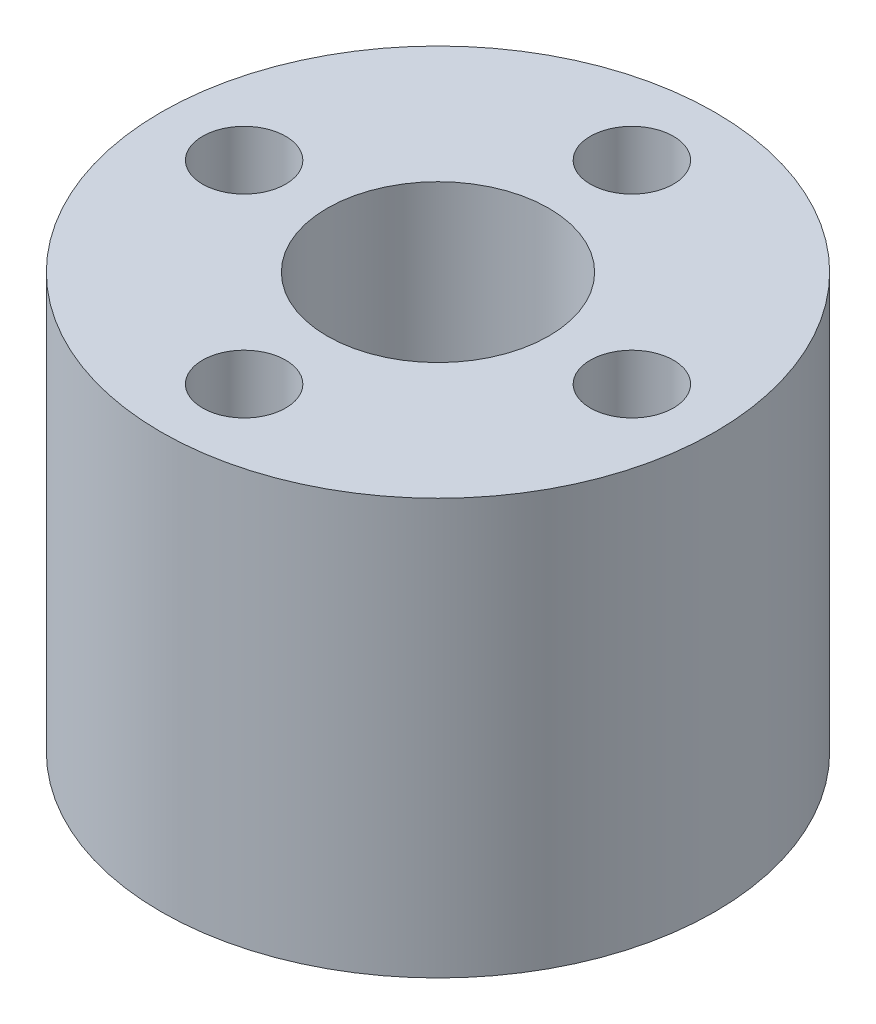
ISO-10303-21;
HEADER;
FILE_DESCRIPTION(('STEP AP214'),'2;1');
FILE_NAME('part.step','',(''),(''),'','','');
FILE_SCHEMA(('AUTOMOTIVE_DESIGN { 1 0 10303 214 1 1 1 1 }'));
ENDSEC;
DATA;
#1=APPLICATION_CONTEXT('core data for automotive mechanical design processes');
#2=APPLICATION_PROTOCOL_DEFINITION('international standard','automotive_design',2000,#1);
#3=PRODUCT_CONTEXT('',#1,'mechanical');
#4=PRODUCT('Part','Part','',(#3));
#5=PRODUCT_RELATED_PRODUCT_CATEGORY('part','',(#4));
#6=PRODUCT_DEFINITION_FORMATION('','',#4);
#7=PRODUCT_DEFINITION_CONTEXT('part definition',#1,'design');
#8=PRODUCT_DEFINITION('design','',#6,#7);
#9=PRODUCT_DEFINITION_SHAPE('','',#8);
#10=(LENGTH_UNIT() NAMED_UNIT(*) SI_UNIT(.MILLI.,.METRE.));
#11=(NAMED_UNIT(*) PLANE_ANGLE_UNIT() SI_UNIT($,.RADIAN.));
#12=(NAMED_UNIT(*) SI_UNIT($,.STERADIAN.) SOLID_ANGLE_UNIT());
#13=UNCERTAINTY_MEASURE_WITH_UNIT(LENGTH_MEASURE(1.E-05),#10,'distance_accuracy_value','');
#14=(GEOMETRIC_REPRESENTATION_CONTEXT(3) GLOBAL_UNCERTAINTY_ASSIGNED_CONTEXT((#13)) GLOBAL_UNIT_ASSIGNED_CONTEXT((#10,
#11,#12)) REPRESENTATION_CONTEXT('',''));
#15=CARTESIAN_POINT('',(0.,0.,0.));
#16=DIRECTION('',(0.,0.,1.));
#17=DIRECTION('',(1.,0.,0.));
#18=AXIS2_PLACEMENT_3D('',#15,#16,#17);
#19=CARTESIAN_POINT('',(0.,15.,0.));
#20=DIRECTION('',(0.,-1.,0.));
#21=DIRECTION('',(0.,0.,-1.));
#22=AXIS2_PLACEMENT_3D('',#19,#20,#21);
#23=CYLINDRICAL_SURFACE('',#22,4.);
#24=CARTESIAN_POINT('',(0.,15.,0.));
#25=DIRECTION('',(0.,1.,0.));
#26=DIRECTION('',(0.,0.,1.));
#27=AXIS2_PLACEMENT_3D('',#24,#25,#26);
#28=CIRCLE('',#27,4.);
#29=CARTESIAN_POINT('',(0.,15.,4.));
#30=VERTEX_POINT('',#29);
#31=EDGE_CURVE('E43',#30,#30,#28,.T.);
#32=ORIENTED_EDGE('',*,*,#31,.T.);
#33=EDGE_LOOP('',(#32));
#34=FACE_BOUND('',#33,.T.);
#35=CARTESIAN_POINT('',(0.,0.,0.));
#36=DIRECTION('',(0.,1.,0.));
#37=DIRECTION('',(0.,0.,1.));
#38=AXIS2_PLACEMENT_3D('',#35,#36,#37);
#39=CIRCLE('',#38,4.);
#40=CARTESIAN_POINT('',(0.,0.,4.));
#41=VERTEX_POINT('',#40);
#42=EDGE_CURVE('E63',#41,#41,#39,.T.);
#43=ORIENTED_EDGE('',*,*,#42,.F.);
#44=EDGE_LOOP('',(#43));
#45=FACE_BOUND('',#44,.T.);
#46=ADVANCED_FACE('F35',(#34,#45),#23,.F.);
#47=CARTESIAN_POINT('',(7.,15.,0.));
#48=DIRECTION('',(0.,-1.,0.));
#49=DIRECTION('',(0.,0.,-1.));
#50=AXIS2_PLACEMENT_3D('',#47,#48,#49);
#51=CYLINDRICAL_SURFACE('',#50,1.5);
#52=CARTESIAN_POINT('',(7.,15.,0.));
#53=DIRECTION('',(0.,1.,0.));
#54=DIRECTION('',(0.,0.,1.));
#55=AXIS2_PLACEMENT_3D('',#52,#53,#54);
#56=CIRCLE('',#55,1.5);
#57=CARTESIAN_POINT('',(7.,15.,1.5));
#58=VERTEX_POINT('',#57);
#59=EDGE_CURVE('E48',#58,#58,#56,.T.);
#60=ORIENTED_EDGE('',*,*,#59,.T.);
#61=EDGE_LOOP('',(#60));
#62=FACE_BOUND('',#61,.T.);
#63=CARTESIAN_POINT('',(7.,0.,0.));
#64=DIRECTION('',(0.,1.,0.));
#65=DIRECTION('',(0.,0.,1.));
#66=AXIS2_PLACEMENT_3D('',#63,#64,#65);
#67=CIRCLE('',#66,1.5);
#68=CARTESIAN_POINT('',(7.,0.,1.5));
#69=VERTEX_POINT('',#68);
#70=EDGE_CURVE('E61',#69,#69,#67,.T.);
#71=ORIENTED_EDGE('',*,*,#70,.F.);
#72=EDGE_LOOP('',(#71));
#73=FACE_BOUND('',#72,.T.);
#74=ADVANCED_FACE('F84',(#62,#73),#51,.F.);
#75=CARTESIAN_POINT('',(0.,15.,-7.));
#76=DIRECTION('',(0.,-1.,0.));
#77=DIRECTION('',(0.,0.,-1.));
#78=AXIS2_PLACEMENT_3D('',#75,#76,#77);
#79=CYLINDRICAL_SURFACE('',#78,1.5);
#80=CARTESIAN_POINT('',(0.,15.,-7.));
#81=DIRECTION('',(0.,1.,0.));
#82=DIRECTION('',(0.,0.,1.));
#83=AXIS2_PLACEMENT_3D('',#80,#81,#82);
#84=CIRCLE('',#83,1.5);
#85=CARTESIAN_POINT('',(0.,15.,-5.5));
#86=VERTEX_POINT('',#85);
#87=EDGE_CURVE('E77',#86,#86,#84,.T.);
#88=ORIENTED_EDGE('',*,*,#87,.T.);
#89=EDGE_LOOP('',(#88));
#90=FACE_BOUND('',#89,.T.);
#91=CARTESIAN_POINT('',(0.,0.,-7.));
#92=DIRECTION('',(0.,1.,0.));
#93=DIRECTION('',(0.,0.,1.));
#94=AXIS2_PLACEMENT_3D('',#91,#92,#93);
#95=CIRCLE('',#94,1.5);
#96=CARTESIAN_POINT('',(0.,0.,-5.5));
#97=VERTEX_POINT('',#96);
#98=EDGE_CURVE('E58',#97,#97,#95,.T.);
#99=ORIENTED_EDGE('',*,*,#98,.F.);
#100=EDGE_LOOP('',(#99));
#101=FACE_BOUND('',#100,.T.);
#102=ADVANCED_FACE('F102',(#90,#101),#79,.F.);
#103=CARTESIAN_POINT('',(-7.,15.,0.));
#104=DIRECTION('',(0.,-1.,0.));
#105=DIRECTION('',(0.,0.,-1.));
#106=AXIS2_PLACEMENT_3D('',#103,#104,#105);
#107=CYLINDRICAL_SURFACE('',#106,1.5);
#108=CARTESIAN_POINT('',(-7.,15.,0.));
#109=DIRECTION('',(0.,1.,0.));
#110=DIRECTION('',(0.,0.,1.));
#111=AXIS2_PLACEMENT_3D('',#108,#109,#110);
#112=CIRCLE('',#111,1.5);
#113=CARTESIAN_POINT('',(-7.,15.,1.5));
#114=VERTEX_POINT('',#113);
#115=EDGE_CURVE('E72',#114,#114,#112,.T.);
#116=ORIENTED_EDGE('',*,*,#115,.T.);
#117=EDGE_LOOP('',(#116));
#118=FACE_BOUND('',#117,.T.);
#119=CARTESIAN_POINT('',(-7.,0.,0.));
#120=DIRECTION('',(0.,1.,0.));
#121=DIRECTION('',(0.,0.,1.));
#122=AXIS2_PLACEMENT_3D('',#119,#120,#121);
#123=CIRCLE('',#122,1.5);
#124=CARTESIAN_POINT('',(-7.,0.,1.5));
#125=VERTEX_POINT('',#124);
#126=EDGE_CURVE('E55',#125,#125,#123,.T.);
#127=ORIENTED_EDGE('',*,*,#126,.F.);
#128=EDGE_LOOP('',(#127));
#129=FACE_BOUND('',#128,.T.);
#130=ADVANCED_FACE('F108',(#118,#129),#107,.F.);
#131=CARTESIAN_POINT('',(0.,15.,7.));
#132=DIRECTION('',(0.,-1.,0.));
#133=DIRECTION('',(0.,0.,-1.));
#134=AXIS2_PLACEMENT_3D('',#131,#132,#133);
#135=CYLINDRICAL_SURFACE('',#134,1.5);
#136=CARTESIAN_POINT('',(0.,15.,7.));
#137=DIRECTION('',(0.,1.,0.));
#138=DIRECTION('',(0.,0.,1.));
#139=AXIS2_PLACEMENT_3D('',#136,#137,#138);
#140=CIRCLE('',#139,1.5);
#141=CARTESIAN_POINT('',(0.,15.,8.5));
#142=VERTEX_POINT('',#141);
#143=EDGE_CURVE('E68',#142,#142,#140,.T.);
#144=ORIENTED_EDGE('',*,*,#143,.T.);
#145=EDGE_LOOP('',(#144));
#146=FACE_BOUND('',#145,.T.);
#147=CARTESIAN_POINT('',(0.,0.,7.));
#148=DIRECTION('',(0.,1.,0.));
#149=DIRECTION('',(0.,0.,1.));
#150=AXIS2_PLACEMENT_3D('',#147,#148,#149);
#151=CIRCLE('',#150,1.5);
#152=CARTESIAN_POINT('',(0.,0.,8.5));
#153=VERTEX_POINT('',#152);
#154=EDGE_CURVE('E52',#153,#153,#151,.T.);
#155=ORIENTED_EDGE('',*,*,#154,.F.);
#156=EDGE_LOOP('',(#155));
#157=FACE_BOUND('',#156,.T.);
#158=ADVANCED_FACE('F37',(#146,#157),#135,.F.);
#159=CARTESIAN_POINT('',(0.,15.,0.));
#160=DIRECTION('',(0.,-1.,0.));
#161=DIRECTION('',(0.,0.,-1.));
#162=AXIS2_PLACEMENT_3D('',#159,#160,#161);
#163=CYLINDRICAL_SURFACE('',#162,10.);
#164=CARTESIAN_POINT('',(0.,15.,0.));
#165=DIRECTION('',(0.,1.,0.));
#166=DIRECTION('',(0.,0.,1.));
#167=AXIS2_PLACEMENT_3D('',#164,#165,#166);
#168=CIRCLE('',#167,10.);
#169=CARTESIAN_POINT('',(0.,15.,10.));
#170=VERTEX_POINT('',#169);
#171=EDGE_CURVE('E10',#170,#170,#168,.T.);
#172=ORIENTED_EDGE('',*,*,#171,.F.);
#173=EDGE_LOOP('',(#172));
#174=FACE_BOUND('',#173,.T.);
#175=CARTESIAN_POINT('',(0.,0.,0.));
#176=DIRECTION('',(0.,1.,0.));
#177=DIRECTION('',(0.,0.,1.));
#178=AXIS2_PLACEMENT_3D('',#175,#176,#177);
#179=CIRCLE('',#178,10.);
#180=CARTESIAN_POINT('',(0.,0.,10.));
#181=VERTEX_POINT('',#180);
#182=EDGE_CURVE('E39',#181,#181,#179,.T.);
#183=ORIENTED_EDGE('',*,*,#182,.T.);
#184=EDGE_LOOP('',(#183));
#185=FACE_BOUND('',#184,.T.);
#186=ADVANCED_FACE('F91',(#174,#185),#163,.T.);
#187=CARTESIAN_POINT('',(0.,15.,0.));
#188=DIRECTION('',(0.,1.,0.));
#189=DIRECTION('',(0.,0.,1.));
#190=AXIS2_PLACEMENT_3D('',#187,#188,#189);
#191=PLANE('',#190);
#192=ORIENTED_EDGE('',*,*,#143,.F.);
#193=EDGE_LOOP('',(#192));
#194=FACE_BOUND('',#193,.T.);
#195=ORIENTED_EDGE('',*,*,#115,.F.);
#196=EDGE_LOOP('',(#195));
#197=FACE_BOUND('',#196,.T.);
#198=ORIENTED_EDGE('',*,*,#87,.F.);
#199=EDGE_LOOP('',(#198));
#200=FACE_BOUND('',#199,.T.);
#201=ORIENTED_EDGE('',*,*,#59,.F.);
#202=EDGE_LOOP('',(#201));
#203=FACE_BOUND('',#202,.T.);
#204=ORIENTED_EDGE('',*,*,#31,.F.);
#205=EDGE_LOOP('',(#204));
#206=FACE_BOUND('',#205,.T.);
#207=ORIENTED_EDGE('',*,*,#171,.T.);
#208=EDGE_LOOP('',(#207));
#209=FACE_BOUND('',#208,.T.);
#210=ADVANCED_FACE('F87',(#194,#197,#200,#203,#206,#209),#191,.T.);
#211=CARTESIAN_POINT('',(0.,0.,0.));
#212=DIRECTION('',(0.,1.,0.));
#213=DIRECTION('',(0.,0.,1.));
#214=AXIS2_PLACEMENT_3D('',#211,#212,#213);
#215=PLANE('',#214);
#216=ORIENTED_EDGE('',*,*,#154,.T.);
#217=EDGE_LOOP('',(#216));
#218=FACE_BOUND('',#217,.T.);
#219=ORIENTED_EDGE('',*,*,#126,.T.);
#220=EDGE_LOOP('',(#219));
#221=FACE_BOUND('',#220,.T.);
#222=ORIENTED_EDGE('',*,*,#98,.T.);
#223=EDGE_LOOP('',(#222));
#224=FACE_BOUND('',#223,.T.);
#225=ORIENTED_EDGE('',*,*,#70,.T.);
#226=EDGE_LOOP('',(#225));
#227=FACE_BOUND('',#226,.T.);
#228=ORIENTED_EDGE('',*,*,#42,.T.);
#229=EDGE_LOOP('',(#228));
#230=FACE_BOUND('',#229,.T.);
#231=ORIENTED_EDGE('',*,*,#182,.F.);
#232=EDGE_LOOP('',(#231));
#233=FACE_BOUND('',#232,.T.);
#234=ADVANCED_FACE('F90',(#218,#221,#224,#227,#230,#233),#215,.F.);
#235=CLOSED_SHELL('',(#46,#74,#102,#130,#158,#186,#210,#234));
#236=MANIFOLD_SOLID_BREP('B2',#235);
#237=ADVANCED_BREP_SHAPE_REPRESENTATION('',(#18,#236),#14);
#238=SHAPE_DEFINITION_REPRESENTATION(#9,#237);
ENDSEC;
END-ISO-10303-21;
